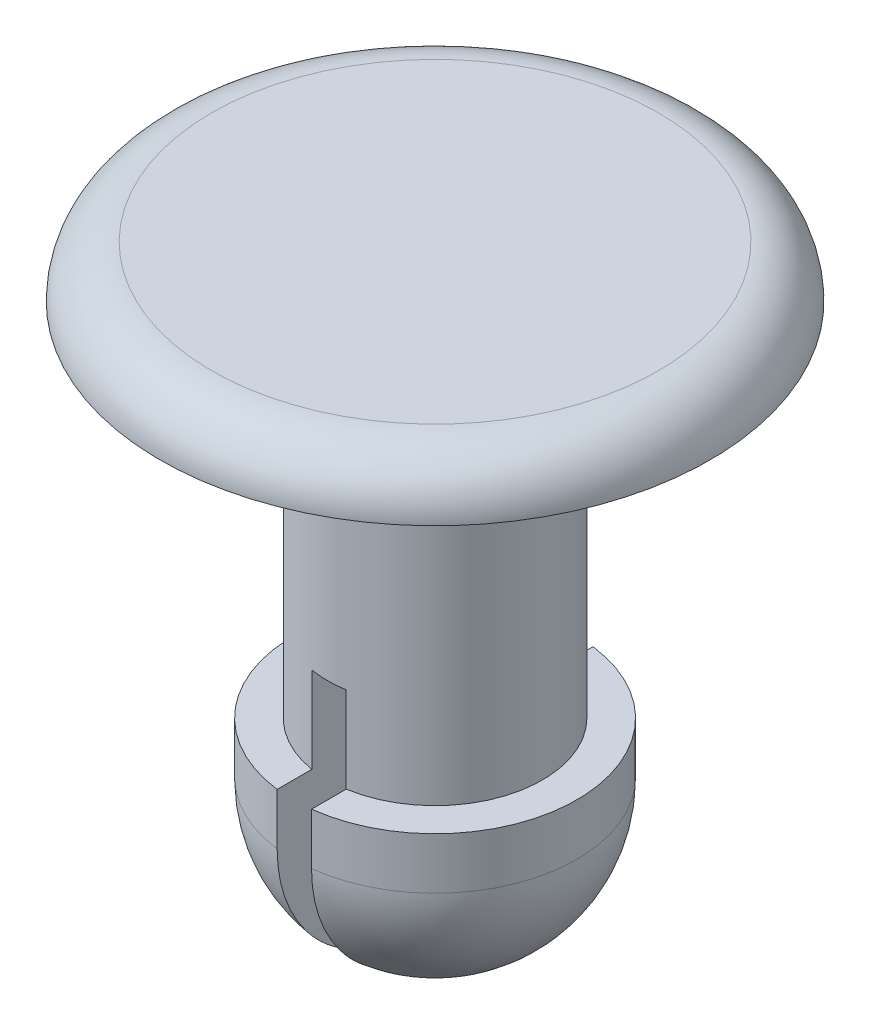
ISO-10303-21;
HEADER;
FILE_DESCRIPTION(('STEP AP214'),'2;1');
FILE_NAME('part.step','',(''),(''),'','','');
FILE_SCHEMA(('AUTOMOTIVE_DESIGN { 1 0 10303 214 1 1 1 1 }'));
ENDSEC;
DATA;
#1=APPLICATION_CONTEXT('core data for automotive mechanical design processes');
#2=APPLICATION_PROTOCOL_DEFINITION('international standard','automotive_design',2000,#1);
#3=PRODUCT_CONTEXT('',#1,'mechanical');
#4=PRODUCT('Part','Part','',(#3));
#5=PRODUCT_RELATED_PRODUCT_CATEGORY('part','',(#4));
#6=PRODUCT_DEFINITION_FORMATION('','',#4);
#7=PRODUCT_DEFINITION_CONTEXT('part definition',#1,'design');
#8=PRODUCT_DEFINITION('design','',#6,#7);
#9=PRODUCT_DEFINITION_SHAPE('','',#8);
#10=(LENGTH_UNIT() NAMED_UNIT(*) SI_UNIT(.MILLI.,.METRE.));
#11=(NAMED_UNIT(*) PLANE_ANGLE_UNIT() SI_UNIT($,.RADIAN.));
#12=(NAMED_UNIT(*) SI_UNIT($,.STERADIAN.) SOLID_ANGLE_UNIT());
#13=UNCERTAINTY_MEASURE_WITH_UNIT(LENGTH_MEASURE(1.E-05),#10,'distance_accuracy_value','');
#14=(GEOMETRIC_REPRESENTATION_CONTEXT(3) GLOBAL_UNCERTAINTY_ASSIGNED_CONTEXT((#13)) GLOBAL_UNIT_ASSIGNED_CONTEXT((#10,
#11,#12)) REPRESENTATION_CONTEXT('',''));
#15=CARTESIAN_POINT('',(0.,0.,0.));
#16=DIRECTION('',(0.,0.,1.));
#17=DIRECTION('',(1.,0.,0.));
#18=AXIS2_PLACEMENT_3D('',#15,#16,#17);
#19=CARTESIAN_POINT('',(1.5875,-5.334,0.));
#20=DIRECTION('',(0.,1.,0.));
#21=DIRECTION('',(-1.,0.,0.));
#22=AXIS2_PLACEMENT_3D('',#19,#20,#21);
#23=PLANE('',#22);
#24=DIRECTION('',(0.,0.,1.));
#25=VECTOR('',#24,1.);
#26=CARTESIAN_POINT('',(-0.253999999999999,-5.334,0.));
#27=LINE('',#26,#25);
#28=CARTESIAN_POINT('',(-0.253999999999997,-5.334,-2.08004909797822));
#29=VERTEX_POINT('',#28);
#30=CARTESIAN_POINT('',(-0.253999999999999,-5.334,-1.56704826026514));
#31=VERTEX_POINT('',#30);
#32=EDGE_CURVE('E57',#29,#31,#27,.T.);
#33=ORIENTED_EDGE('',*,*,#32,.F.);
#34=CARTESIAN_POINT('',(0.,-5.334,0.));
#35=DIRECTION('',(0.,1.,0.));
#36=DIRECTION('',(-1.,0.,0.));
#37=AXIS2_PLACEMENT_3D('',#34,#35,#36);
#38=CIRCLE('',#37,2.0955);
#39=CARTESIAN_POINT('',(-0.253999999999997,-5.334,2.08004909797822));
#40=VERTEX_POINT('',#39);
#41=EDGE_CURVE('E137',#29,#40,#38,.T.);
#42=ORIENTED_EDGE('',*,*,#41,.T.);
#43=CARTESIAN_POINT('',(-0.253999999999999,-5.334,1.56704826026514));
#44=VERTEX_POINT('',#43);
#45=EDGE_CURVE('E127',#44,#40,#27,.T.);
#46=ORIENTED_EDGE('',*,*,#45,.F.);
#47=CARTESIAN_POINT('',(0.,-5.334,0.));
#48=DIRECTION('',(0.,1.,0.));
#49=DIRECTION('',(-1.,0.,0.));
#50=AXIS2_PLACEMENT_3D('',#47,#48,#49);
#51=CIRCLE('',#50,1.5875);
#52=EDGE_CURVE('E141',#31,#44,#51,.T.);
#53=ORIENTED_EDGE('',*,*,#52,.F.);
#54=EDGE_LOOP('',(#33,#42,#46,#53));
#55=FACE_BOUND('',#54,.T.);
#56=ADVANCED_FACE('F34',(#55),#23,.T.);
#57=CARTESIAN_POINT('',(0.,0.,0.));
#58=DIRECTION('',(0.,1.,0.));
#59=DIRECTION('',(-1.,0.,0.));
#60=AXIS2_PLACEMENT_3D('',#57,#58,#59);
#61=CYLINDRICAL_SURFACE('',#60,2.0955);
#62=DIRECTION('',(0.,1.,0.));
#63=VECTOR('',#62,1.);
#64=CARTESIAN_POINT('',(-0.253999999999997,0.,2.08004909797822));
#65=LINE('',#64,#63);
#66=CARTESIAN_POINT('',(-0.253999999999999,-6.096,2.08004909797822));
#67=VERTEX_POINT('',#66);
#68=EDGE_CURVE('E120',#40,#67,#65,.F.);
#69=ORIENTED_EDGE('',*,*,#68,.F.);
#70=ORIENTED_EDGE('',*,*,#41,.F.);
#71=DIRECTION('',(0.,1.,0.));
#72=VECTOR('',#71,1.);
#73=CARTESIAN_POINT('',(-0.253999999999997,0.,-2.08004909797822));
#74=LINE('',#73,#72);
#75=CARTESIAN_POINT('',(-0.253999999999999,-6.096,-2.08004909797822));
#76=VERTEX_POINT('',#75);
#77=EDGE_CURVE('E118',#76,#29,#74,.T.);
#78=ORIENTED_EDGE('',*,*,#77,.F.);
#79=CARTESIAN_POINT('',(0.,-6.096,0.));
#80=DIRECTION('',(0.,1.,0.));
#81=DIRECTION('',(-1.,0.,0.));
#82=AXIS2_PLACEMENT_3D('',#79,#80,#81);
#83=CIRCLE('',#82,2.0955);
#84=EDGE_CURVE('E133',#76,#67,#83,.T.);
#85=ORIENTED_EDGE('',*,*,#84,.T.);
#86=EDGE_LOOP('',(#69,#70,#78,#85));
#87=FACE_BOUND('',#86,.T.);
#88=ADVANCED_FACE('F186',(#87),#61,.T.);
#89=CARTESIAN_POINT('',(0.,-6.096,0.));
#90=DIRECTION('',(0.,1.,0.));
#91=DIRECTION('',(1.,0.,0.));
#92=AXIS2_PLACEMENT_3D('',#89,#90,#91);
#93=SPHERICAL_SURFACE('',#92,2.0955);
#94=CARTESIAN_POINT('',(-0.253999999999999,-6.096,0.));
#95=DIRECTION('',(-1.,0.,0.));
#96=DIRECTION('',(0.,-1.,0.));
#97=AXIS2_PLACEMENT_3D('',#94,#95,#96);
#98=CIRCLE('',#97,2.08004909797822);
#99=EDGE_CURVE('E154',#67,#76,#98,.F.);
#100=ORIENTED_EDGE('',*,*,#99,.F.);
#101=ORIENTED_EDGE('',*,*,#84,.F.);
#102=EDGE_LOOP('',(#100,#101));
#103=FACE_BOUND('',#102,.T.);
#104=ADVANCED_FACE('F179',(#103),#93,.T.);
#105=CARTESIAN_POINT('',(0.,0.762,0.));
#106=DIRECTION('',(0.,1.,0.));
#107=DIRECTION('',(-1.,0.,0.));
#108=AXIS2_PLACEMENT_3D('',#105,#106,#107);
#109=PLANE('',#108);
#110=CARTESIAN_POINT('',(0.,0.762,0.));
#111=DIRECTION('',(0.,1.,0.));
#112=DIRECTION('',(-1.,0.,0.));
#113=AXIS2_PLACEMENT_3D('',#110,#111,#112);
#114=CIRCLE('',#113,3.302);
#115=CARTESIAN_POINT('',(-3.302,0.762,0.));
#116=VERTEX_POINT('',#115);
#117=EDGE_CURVE('E150',#116,#116,#114,.T.);
#118=ORIENTED_EDGE('',*,*,#117,.T.);
#119=EDGE_LOOP('',(#118));
#120=FACE_BOUND('',#119,.T.);
#121=ADVANCED_FACE('F189',(#120),#109,.T.);
#122=CARTESIAN_POINT('',(4.064,0.,0.));
#123=DIRECTION('',(0.,-1.,0.));
#124=DIRECTION('',(1.,0.,0.));
#125=AXIS2_PLACEMENT_3D('',#122,#123,#124);
#126=PLANE('',#125);
#127=CARTESIAN_POINT('',(0.,0.,0.));
#128=DIRECTION('',(0.,1.,0.));
#129=DIRECTION('',(-1.,0.,0.));
#130=AXIS2_PLACEMENT_3D('',#127,#128,#129);
#131=CIRCLE('',#130,1.58749999999999);
#132=CARTESIAN_POINT('',(-1.58749999999999,0.,0.));
#133=VERTEX_POINT('',#132);
#134=EDGE_CURVE('E144',#133,#133,#131,.T.);
#135=ORIENTED_EDGE('',*,*,#134,.T.);
#136=EDGE_LOOP('',(#135));
#137=FACE_BOUND('',#136,.T.);
#138=CARTESIAN_POINT('',(0.,0.,0.));
#139=DIRECTION('',(0.,1.,0.));
#140=DIRECTION('',(-1.,0.,0.));
#141=AXIS2_PLACEMENT_3D('',#138,#139,#140);
#142=CIRCLE('',#141,4.064);
#143=CARTESIAN_POINT('',(-4.064,0.,0.));
#144=VERTEX_POINT('',#143);
#145=EDGE_CURVE('E147',#144,#144,#142,.T.);
#146=ORIENTED_EDGE('',*,*,#145,.F.);
#147=EDGE_LOOP('',(#146));
#148=FACE_BOUND('',#147,.T.);
#149=ADVANCED_FACE('F203',(#137,#148),#126,.T.);
#150=CARTESIAN_POINT('',(0.,0.,0.));
#151=DIRECTION('',(0.,1.,0.));
#152=DIRECTION('',(-1.,0.,0.));
#153=AXIS2_PLACEMENT_3D('',#150,#151,#152);
#154=CYLINDRICAL_SURFACE('',#153,1.5875);
#155=DIRECTION('',(0.,1.,0.));
#156=VECTOR('',#155,1.);
#157=CARTESIAN_POINT('',(-0.253999999999997,0.,-1.56704826026514));
#158=LINE('',#157,#156);
#159=CARTESIAN_POINT('',(-0.253999999999998,-4.064,-1.56704826026514));
#160=VERTEX_POINT('',#159);
#161=EDGE_CURVE('E129',#31,#160,#158,.T.);
#162=ORIENTED_EDGE('',*,*,#161,.F.);
#163=ORIENTED_EDGE('',*,*,#52,.T.);
#164=DIRECTION('',(0.,1.,0.));
#165=VECTOR('',#164,1.);
#166=CARTESIAN_POINT('',(-0.253999999999997,0.,1.56704826026514));
#167=LINE('',#166,#165);
#168=CARTESIAN_POINT('',(-0.253999999999998,-4.064,1.56704826026514));
#169=VERTEX_POINT('',#168);
#170=EDGE_CURVE('E131',#169,#44,#167,.F.);
#171=ORIENTED_EDGE('',*,*,#170,.F.);
#172=CARTESIAN_POINT('',(0.,-4.064,0.));
#173=DIRECTION('',(0.,-1.,0.));
#174=DIRECTION('',(0.,0.,-1.));
#175=AXIS2_PLACEMENT_3D('',#172,#173,#174);
#176=CIRCLE('',#175,1.5875);
#177=CARTESIAN_POINT('',(0.254,-4.064,1.56704826026514));
#178=VERTEX_POINT('',#177);
#179=EDGE_CURVE('E38',#169,#178,#176,.F.);
#180=ORIENTED_EDGE('',*,*,#179,.T.);
#181=DIRECTION('',(0.,1.,0.));
#182=VECTOR('',#181,1.);
#183=CARTESIAN_POINT('',(0.254,0.,1.56704826026514));
#184=LINE('',#183,#182);
#185=CARTESIAN_POINT('',(0.254,-5.334,1.56704826026514));
#186=VERTEX_POINT('',#185);
#187=EDGE_CURVE('E111',#186,#178,#184,.T.);
#188=ORIENTED_EDGE('',*,*,#187,.F.);
#189=CARTESIAN_POINT('',(0.254,-5.334,-1.56704826026514));
#190=VERTEX_POINT('',#189);
#191=EDGE_CURVE('E117',#186,#190,#51,.T.);
#192=ORIENTED_EDGE('',*,*,#191,.T.);
#193=DIRECTION('',(0.,1.,0.));
#194=VECTOR('',#193,1.);
#195=CARTESIAN_POINT('',(0.254,0.,-1.56704826026514));
#196=LINE('',#195,#194);
#197=CARTESIAN_POINT('',(0.254,-4.064,-1.56704826026514));
#198=VERTEX_POINT('',#197);
#199=EDGE_CURVE('E108',#198,#190,#196,.F.);
#200=ORIENTED_EDGE('',*,*,#199,.F.);
#201=EDGE_CURVE('E11',#198,#160,#176,.F.);
#202=ORIENTED_EDGE('',*,*,#201,.T.);
#203=EDGE_LOOP('',(#162,#163,#171,#180,#188,#192,#200,#202));
#204=FACE_BOUND('',#203,.T.);
#205=ORIENTED_EDGE('',*,*,#134,.F.);
#206=EDGE_LOOP('',(#205));
#207=FACE_BOUND('',#206,.T.);
#208=ADVANCED_FACE('F114',(#204,#207),#154,.T.);
#209=DIRECTION('',(0.,0.,-1.));
#210=VECTOR('',#209,1.);
#211=CARTESIAN_POINT('',(0.254,-5.334,0.));
#212=LINE('',#211,#210);
#213=CARTESIAN_POINT('',(0.253999999999999,-5.334,2.08004909797822));
#214=VERTEX_POINT('',#213);
#215=EDGE_CURVE('E122',#214,#186,#212,.T.);
#216=ORIENTED_EDGE('',*,*,#215,.F.);
#217=CARTESIAN_POINT('',(0.253999999999999,-5.334,-2.08004909797822));
#218=VERTEX_POINT('',#217);
#219=EDGE_CURVE('E140',#214,#218,#38,.T.);
#220=ORIENTED_EDGE('',*,*,#219,.T.);
#221=EDGE_CURVE('E164',#190,#218,#212,.T.);
#222=ORIENTED_EDGE('',*,*,#221,.F.);
#223=ORIENTED_EDGE('',*,*,#191,.F.);
#224=EDGE_LOOP('',(#216,#220,#222,#223));
#225=FACE_BOUND('',#224,.T.);
#226=ADVANCED_FACE('F170',(#225),#23,.T.);
#227=DIRECTION('',(0.,1.,0.));
#228=VECTOR('',#227,1.);
#229=CARTESIAN_POINT('',(0.254,0.,-2.08004909797822));
#230=LINE('',#229,#228);
#231=CARTESIAN_POINT('',(0.254,-6.096,-2.08004909797822));
#232=VERTEX_POINT('',#231);
#233=EDGE_CURVE('E49',#218,#232,#230,.F.);
#234=ORIENTED_EDGE('',*,*,#233,.F.);
#235=ORIENTED_EDGE('',*,*,#219,.F.);
#236=DIRECTION('',(0.,1.,0.));
#237=VECTOR('',#236,1.);
#238=CARTESIAN_POINT('',(0.254,0.,2.08004909797822));
#239=LINE('',#238,#237);
#240=CARTESIAN_POINT('',(0.254,-6.096,2.08004909797822));
#241=VERTEX_POINT('',#240);
#242=EDGE_CURVE('E160',#241,#214,#239,.T.);
#243=ORIENTED_EDGE('',*,*,#242,.F.);
#244=EDGE_CURVE('E136',#241,#232,#83,.T.);
#245=ORIENTED_EDGE('',*,*,#244,.T.);
#246=EDGE_LOOP('',(#234,#235,#243,#245));
#247=FACE_BOUND('',#246,.T.);
#248=ADVANCED_FACE('F172',(#247),#61,.T.);
#249=CARTESIAN_POINT('',(0.254,-6.096,0.));
#250=DIRECTION('',(1.,0.,0.));
#251=DIRECTION('',(0.,0.,-1.));
#252=AXIS2_PLACEMENT_3D('',#249,#250,#251);
#253=CIRCLE('',#252,2.08004909797822);
#254=EDGE_CURVE('E153',#232,#241,#253,.F.);
#255=ORIENTED_EDGE('',*,*,#254,.F.);
#256=ORIENTED_EDGE('',*,*,#244,.F.);
#257=EDGE_LOOP('',(#255,#256));
#258=FACE_BOUND('',#257,.T.);
#259=ADVANCED_FACE('F176',(#258),#93,.T.);
#260=CARTESIAN_POINT('',(0.,0.,0.));
#261=DIRECTION('',(0.,1.,0.));
#262=DIRECTION('',(-1.,0.,0.));
#263=AXIS2_PLACEMENT_3D('',#260,#261,#262);
#264=TOROIDAL_SURFACE('',#263,3.302,0.762);
#265=ORIENTED_EDGE('',*,*,#145,.T.);
#266=EDGE_LOOP('',(#265));
#267=FACE_BOUND('',#266,.T.);
#268=ORIENTED_EDGE('',*,*,#117,.F.);
#269=EDGE_LOOP('',(#268));
#270=FACE_BOUND('',#269,.T.);
#271=ADVANCED_FACE('F36',(#267,#270),#264,.T.);
#272=CARTESIAN_POINT('',(-0.253999999999998,-4.064,-4.064));
#273=DIRECTION('',(-1.,0.,0.));
#274=DIRECTION('',(0.,-1.,0.));
#275=AXIS2_PLACEMENT_3D('',#272,#273,#274);
#276=PLANE('',#275);
#277=ORIENTED_EDGE('',*,*,#170,.T.);
#278=ORIENTED_EDGE('',*,*,#45,.T.);
#279=ORIENTED_EDGE('',*,*,#68,.T.);
#280=ORIENTED_EDGE('',*,*,#99,.T.);
#281=ORIENTED_EDGE('',*,*,#77,.T.);
#282=ORIENTED_EDGE('',*,*,#32,.T.);
#283=ORIENTED_EDGE('',*,*,#161,.T.);
#284=DIRECTION('',(0.,0.,1.));
#285=VECTOR('',#284,1.);
#286=CARTESIAN_POINT('',(-0.253999999999998,-4.064,-4.064));
#287=LINE('',#286,#285);
#288=EDGE_CURVE('E104',#160,#169,#287,.T.);
#289=ORIENTED_EDGE('',*,*,#288,.T.);
#290=EDGE_LOOP('',(#277,#278,#279,#280,#281,#282,#283,#289));
#291=FACE_BOUND('',#290,.T.);
#292=ADVANCED_FACE('F158',(#291),#276,.F.);
#293=CARTESIAN_POINT('',(-0.253999999999998,-4.064,-4.064));
#294=DIRECTION('',(0.,-1.,0.));
#295=DIRECTION('',(0.,0.,-1.));
#296=AXIS2_PLACEMENT_3D('',#293,#294,#295);
#297=PLANE('',#296);
#298=ORIENTED_EDGE('',*,*,#288,.F.);
#299=ORIENTED_EDGE('',*,*,#201,.F.);
#300=DIRECTION('',(0.,0.,1.));
#301=VECTOR('',#300,1.);
#302=CARTESIAN_POINT('',(0.254,-4.064,-4.064));
#303=LINE('',#302,#301);
#304=EDGE_CURVE('E101',#198,#178,#303,.T.);
#305=ORIENTED_EDGE('',*,*,#304,.T.);
#306=ORIENTED_EDGE('',*,*,#179,.F.);
#307=EDGE_LOOP('',(#298,#299,#305,#306));
#308=FACE_BOUND('',#307,.T.);
#309=ADVANCED_FACE('F100',(#308),#297,.T.);
#310=CARTESIAN_POINT('',(0.254,-8.1915,-4.064));
#311=DIRECTION('',(1.,0.,0.));
#312=DIRECTION('',(0.,0.,-1.));
#313=AXIS2_PLACEMENT_3D('',#310,#311,#312);
#314=PLANE('',#313);
#315=ORIENTED_EDGE('',*,*,#199,.T.);
#316=ORIENTED_EDGE('',*,*,#221,.T.);
#317=ORIENTED_EDGE('',*,*,#233,.T.);
#318=ORIENTED_EDGE('',*,*,#254,.T.);
#319=ORIENTED_EDGE('',*,*,#242,.T.);
#320=ORIENTED_EDGE('',*,*,#215,.T.);
#321=ORIENTED_EDGE('',*,*,#187,.T.);
#322=ORIENTED_EDGE('',*,*,#304,.F.);
#323=EDGE_LOOP('',(#315,#316,#317,#318,#319,#320,#321,#322));
#324=FACE_BOUND('',#323,.T.);
#325=ADVANCED_FACE('F107',(#324),#314,.F.);
#326=CLOSED_SHELL('',(#56,#88,#104,#121,#149,#208,#226,#248,#259,#271,#292,#309,#325));
#327=MANIFOLD_SOLID_BREP('B2',#326);
#328=ADVANCED_BREP_SHAPE_REPRESENTATION('',(#18,#327),#14);
#329=SHAPE_DEFINITION_REPRESENTATION(#9,#328);
ENDSEC;
END-ISO-10303-21;
